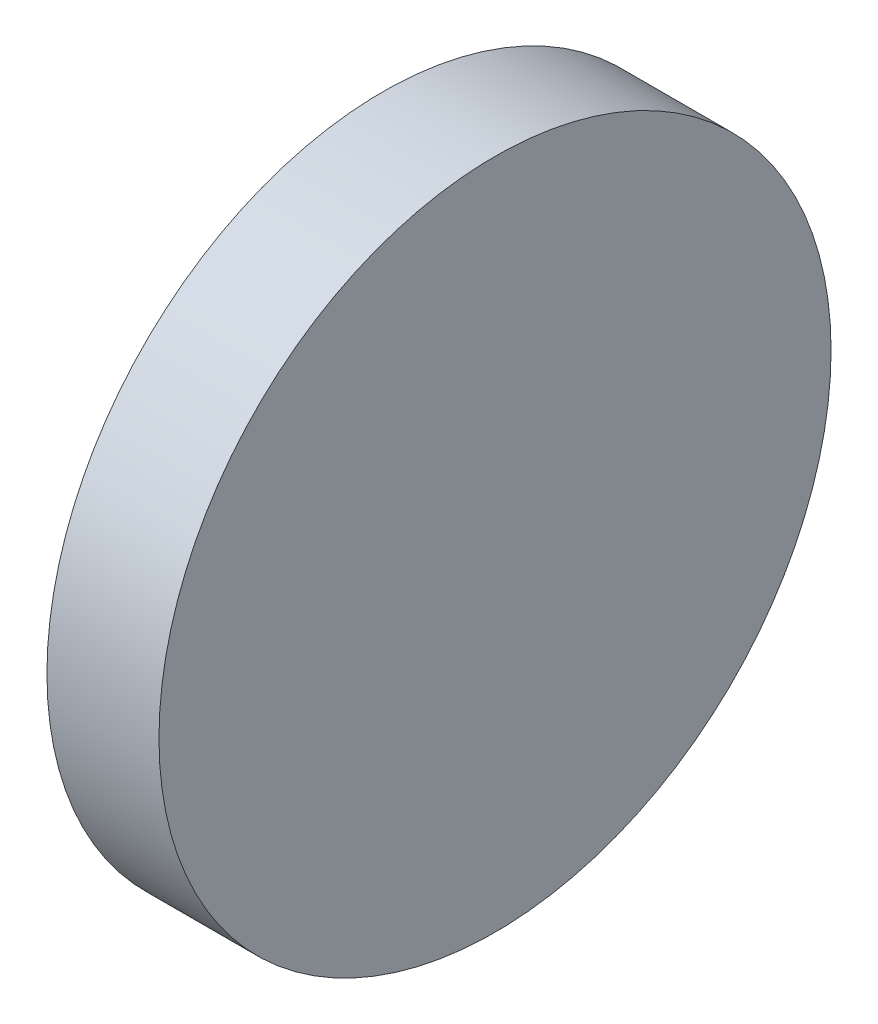
ISO-10303-21;
HEADER;
FILE_DESCRIPTION(('STEP AP214'),'2;1');
FILE_NAME('part.step','',(''),(''),'','','');
FILE_SCHEMA(('AUTOMOTIVE_DESIGN { 1 0 10303 214 1 1 1 1 }'));
ENDSEC;
DATA;
#1=APPLICATION_CONTEXT('core data for automotive mechanical design processes');
#2=APPLICATION_PROTOCOL_DEFINITION('international standard','automotive_design',2000,#1);
#3=PRODUCT_CONTEXT('',#1,'mechanical');
#4=PRODUCT('Part','Part','',(#3));
#5=PRODUCT_RELATED_PRODUCT_CATEGORY('part','',(#4));
#6=PRODUCT_DEFINITION_FORMATION('','',#4);
#7=PRODUCT_DEFINITION_CONTEXT('part definition',#1,'design');
#8=PRODUCT_DEFINITION('design','',#6,#7);
#9=PRODUCT_DEFINITION_SHAPE('','',#8);
#10=(LENGTH_UNIT() NAMED_UNIT(*) SI_UNIT(.MILLI.,.METRE.));
#11=(NAMED_UNIT(*) PLANE_ANGLE_UNIT() SI_UNIT($,.RADIAN.));
#12=(NAMED_UNIT(*) SI_UNIT($,.STERADIAN.) SOLID_ANGLE_UNIT());
#13=UNCERTAINTY_MEASURE_WITH_UNIT(LENGTH_MEASURE(1.E-05),#10,'distance_accuracy_value','');
#14=(GEOMETRIC_REPRESENTATION_CONTEXT(3) GLOBAL_UNCERTAINTY_ASSIGNED_CONTEXT((#13)) GLOBAL_UNIT_ASSIGNED_CONTEXT((#10,
#11,#12)) REPRESENTATION_CONTEXT('',''));
#15=CARTESIAN_POINT('',(0.,0.,0.));
#16=DIRECTION('',(0.,0.,1.));
#17=DIRECTION('',(1.,0.,0.));
#18=AXIS2_PLACEMENT_3D('',#15,#16,#17);
#19=CARTESIAN_POINT('',(12.7,0.,0.));
#20=DIRECTION('',(-1.,0.,0.));
#21=DIRECTION('',(0.,0.,1.));
#22=AXIS2_PLACEMENT_3D('',#19,#20,#21);
#23=CYLINDRICAL_SURFACE('',#22,38.1);
#24=CARTESIAN_POINT('',(12.7,0.,0.));
#25=DIRECTION('',(1.,0.,0.));
#26=DIRECTION('',(0.,0.,-1.));
#27=AXIS2_PLACEMENT_3D('',#24,#25,#26);
#28=CIRCLE('',#27,38.1);
#29=CARTESIAN_POINT('',(12.7,0.,-38.1));
#30=VERTEX_POINT('',#29);
#31=EDGE_CURVE('E10',#30,#30,#28,.T.);
#32=ORIENTED_EDGE('',*,*,#31,.F.);
#33=EDGE_LOOP('',(#32));
#34=FACE_BOUND('',#33,.T.);
#35=CARTESIAN_POINT('',(0.,0.,0.));
#36=DIRECTION('',(1.,0.,0.));
#37=DIRECTION('',(0.,0.,-1.));
#38=AXIS2_PLACEMENT_3D('',#35,#36,#37);
#39=CIRCLE('',#38,38.1);
#40=CARTESIAN_POINT('',(0.,0.,-38.1));
#41=VERTEX_POINT('',#40);
#42=EDGE_CURVE('E33',#41,#41,#39,.T.);
#43=ORIENTED_EDGE('',*,*,#42,.T.);
#44=EDGE_LOOP('',(#43));
#45=FACE_BOUND('',#44,.T.);
#46=ADVANCED_FACE('F30',(#34,#45),#23,.T.);
#47=CARTESIAN_POINT('',(12.7,0.,0.));
#48=DIRECTION('',(1.,0.,0.));
#49=DIRECTION('',(0.,0.,-1.));
#50=AXIS2_PLACEMENT_3D('',#47,#48,#49);
#51=PLANE('',#50);
#52=ORIENTED_EDGE('',*,*,#31,.T.);
#53=EDGE_LOOP('',(#52));
#54=FACE_BOUND('',#53,.T.);
#55=ADVANCED_FACE('F45',(#54),#51,.T.);
#56=CARTESIAN_POINT('',(0.,0.,0.));
#57=DIRECTION('',(1.,0.,0.));
#58=DIRECTION('',(0.,0.,-1.));
#59=AXIS2_PLACEMENT_3D('',#56,#57,#58);
#60=PLANE('',#59);
#61=ORIENTED_EDGE('',*,*,#42,.F.);
#62=EDGE_LOOP('',(#61));
#63=FACE_BOUND('',#62,.T.);
#64=ADVANCED_FACE('F43',(#63),#60,.F.);
#65=CLOSED_SHELL('',(#46,#55,#64));
#66=MANIFOLD_SOLID_BREP('B2',#65);
#67=ADVANCED_BREP_SHAPE_REPRESENTATION('',(#18,#66),#14);
#68=SHAPE_DEFINITION_REPRESENTATION(#9,#67);
ENDSEC;
END-ISO-10303-21;
